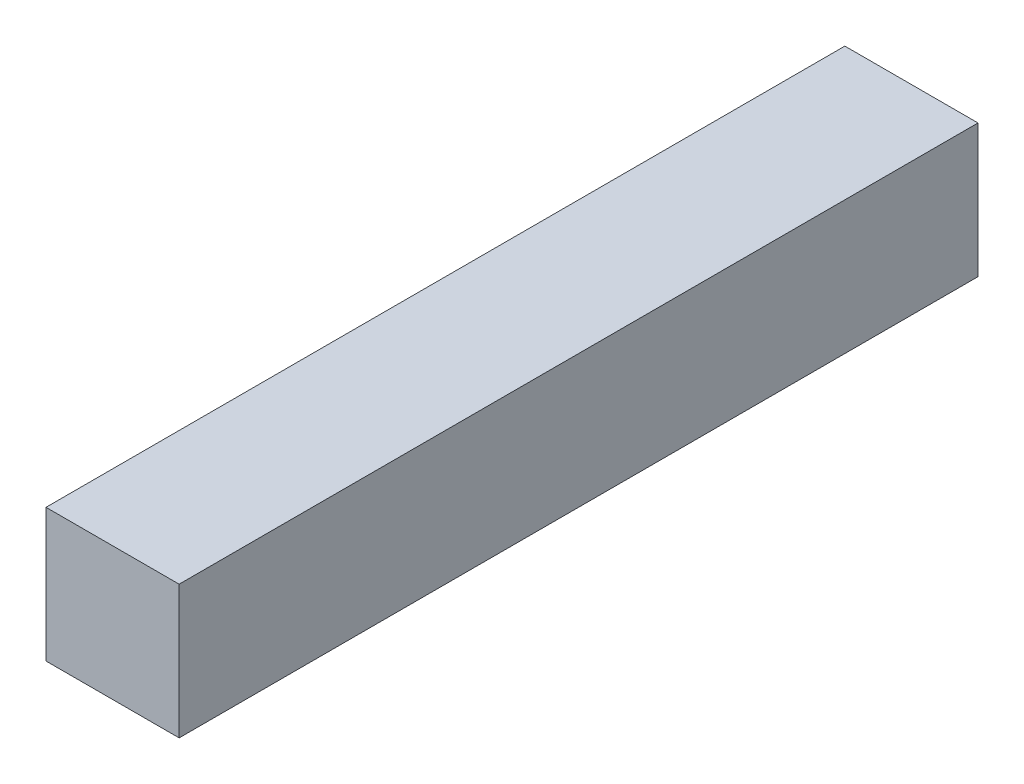
ISO-10303-21;
HEADER;
FILE_DESCRIPTION(('STEP AP214'),'2;1');
FILE_NAME('part.step','',(''),(''),'','','');
FILE_SCHEMA(('AUTOMOTIVE_DESIGN { 1 0 10303 214 1 1 1 1 }'));
ENDSEC;
DATA;
#1=APPLICATION_CONTEXT('core data for automotive mechanical design processes');
#2=APPLICATION_PROTOCOL_DEFINITION('international standard','automotive_design',2000,#1);
#3=PRODUCT_CONTEXT('',#1,'mechanical');
#4=PRODUCT('Part','Part','',(#3));
#5=PRODUCT_RELATED_PRODUCT_CATEGORY('part','',(#4));
#6=PRODUCT_DEFINITION_FORMATION('','',#4);
#7=PRODUCT_DEFINITION_CONTEXT('part definition',#1,'design');
#8=PRODUCT_DEFINITION('design','',#6,#7);
#9=PRODUCT_DEFINITION_SHAPE('','',#8);
#10=(LENGTH_UNIT() NAMED_UNIT(*) SI_UNIT(.MILLI.,.METRE.));
#11=(NAMED_UNIT(*) PLANE_ANGLE_UNIT() SI_UNIT($,.RADIAN.));
#12=(NAMED_UNIT(*) SI_UNIT($,.STERADIAN.) SOLID_ANGLE_UNIT());
#13=UNCERTAINTY_MEASURE_WITH_UNIT(LENGTH_MEASURE(1.E-05),#10,'distance_accuracy_value','');
#14=(GEOMETRIC_REPRESENTATION_CONTEXT(3) GLOBAL_UNCERTAINTY_ASSIGNED_CONTEXT((#13)) GLOBAL_UNIT_ASSIGNED_CONTEXT((#10,
#11,#12)) REPRESENTATION_CONTEXT('',''));
#15=CARTESIAN_POINT('',(0.,0.,0.));
#16=DIRECTION('',(0.,0.,1.));
#17=DIRECTION('',(1.,0.,0.));
#18=AXIS2_PLACEMENT_3D('',#15,#16,#17);
#19=CARTESIAN_POINT('',(0.,0.,30.));
#20=DIRECTION('',(1.,0.,0.));
#21=DIRECTION('',(0.,0.,-1.));
#22=AXIS2_PLACEMENT_3D('',#19,#20,#21);
#23=PLANE('',#22);
#24=DIRECTION('',(0.,-1.,0.));
#25=VECTOR('',#24,1.);
#26=CARTESIAN_POINT('',(0.,0.,0.));
#27=LINE('',#26,#25);
#28=CARTESIAN_POINT('',(0.,5.,0.));
#29=VERTEX_POINT('',#28);
#30=CARTESIAN_POINT('',(0.,0.,0.));
#31=VERTEX_POINT('',#30);
#32=EDGE_CURVE('E116',#29,#31,#27,.T.);
#33=ORIENTED_EDGE('',*,*,#32,.T.);
#34=DIRECTION('',(0.,0.,-1.));
#35=VECTOR('',#34,1.);
#36=CARTESIAN_POINT('',(0.,0.,30.));
#37=LINE('',#36,#35);
#38=CARTESIAN_POINT('',(0.,0.,30.));
#39=VERTEX_POINT('',#38);
#40=EDGE_CURVE('E11',#39,#31,#37,.T.);
#41=ORIENTED_EDGE('',*,*,#40,.F.);
#42=DIRECTION('',(0.,-1.,0.));
#43=VECTOR('',#42,1.);
#44=CARTESIAN_POINT('',(0.,0.,30.));
#45=LINE('',#44,#43);
#46=CARTESIAN_POINT('',(0.,5.,30.));
#47=VERTEX_POINT('',#46);
#48=EDGE_CURVE('E98',#47,#39,#45,.T.);
#49=ORIENTED_EDGE('',*,*,#48,.F.);
#50=DIRECTION('',(0.,0.,-1.));
#51=VECTOR('',#50,1.);
#52=CARTESIAN_POINT('',(0.,5.,30.));
#53=LINE('',#52,#51);
#54=EDGE_CURVE('E112',#47,#29,#53,.T.);
#55=ORIENTED_EDGE('',*,*,#54,.T.);
#56=EDGE_LOOP('',(#33,#41,#49,#55));
#57=FACE_BOUND('',#56,.T.);
#58=ADVANCED_FACE('F46',(#57),#23,.F.);
#59=CARTESIAN_POINT('',(0.,0.,30.));
#60=DIRECTION('',(0.,1.,0.));
#61=DIRECTION('',(0.,0.,1.));
#62=AXIS2_PLACEMENT_3D('',#59,#60,#61);
#63=PLANE('',#62);
#64=DIRECTION('',(1.,0.,0.));
#65=VECTOR('',#64,1.);
#66=CARTESIAN_POINT('',(0.,0.,0.));
#67=LINE('',#66,#65);
#68=CARTESIAN_POINT('',(5.,0.,0.));
#69=VERTEX_POINT('',#68);
#70=EDGE_CURVE('E103',#31,#69,#67,.T.);
#71=ORIENTED_EDGE('',*,*,#70,.T.);
#72=DIRECTION('',(0.,0.,-1.));
#73=VECTOR('',#72,1.);
#74=CARTESIAN_POINT('',(5.,0.,30.));
#75=LINE('',#74,#73);
#76=CARTESIAN_POINT('',(5.,0.,30.));
#77=VERTEX_POINT('',#76);
#78=EDGE_CURVE('E55',#77,#69,#75,.T.);
#79=ORIENTED_EDGE('',*,*,#78,.F.);
#80=DIRECTION('',(1.,0.,0.));
#81=VECTOR('',#80,1.);
#82=CARTESIAN_POINT('',(0.,0.,30.));
#83=LINE('',#82,#81);
#84=EDGE_CURVE('E93',#39,#77,#83,.T.);
#85=ORIENTED_EDGE('',*,*,#84,.F.);
#86=ORIENTED_EDGE('',*,*,#40,.T.);
#87=EDGE_LOOP('',(#71,#79,#85,#86));
#88=FACE_BOUND('',#87,.T.);
#89=ADVANCED_FACE('F102',(#88),#63,.F.);
#90=CARTESIAN_POINT('',(5.,0.,30.));
#91=DIRECTION('',(-1.,0.,0.));
#92=DIRECTION('',(0.,0.,1.));
#93=AXIS2_PLACEMENT_3D('',#90,#91,#92);
#94=PLANE('',#93);
#95=DIRECTION('',(0.,1.,0.));
#96=VECTOR('',#95,1.);
#97=CARTESIAN_POINT('',(5.,0.,0.));
#98=LINE('',#97,#96);
#99=CARTESIAN_POINT('',(5.,5.,0.));
#100=VERTEX_POINT('',#99);
#101=EDGE_CURVE('E80',#69,#100,#98,.T.);
#102=ORIENTED_EDGE('',*,*,#101,.T.);
#103=DIRECTION('',(0.,0.,-1.));
#104=VECTOR('',#103,1.);
#105=CARTESIAN_POINT('',(5.,5.,30.));
#106=LINE('',#105,#104);
#107=CARTESIAN_POINT('',(5.,5.,30.));
#108=VERTEX_POINT('',#107);
#109=EDGE_CURVE('E105',#108,#100,#106,.T.);
#110=ORIENTED_EDGE('',*,*,#109,.F.);
#111=DIRECTION('',(0.,1.,0.));
#112=VECTOR('',#111,1.);
#113=CARTESIAN_POINT('',(5.,0.,30.));
#114=LINE('',#113,#112);
#115=EDGE_CURVE('E96',#77,#108,#114,.T.);
#116=ORIENTED_EDGE('',*,*,#115,.F.);
#117=ORIENTED_EDGE('',*,*,#78,.T.);
#118=EDGE_LOOP('',(#102,#110,#116,#117));
#119=FACE_BOUND('',#118,.T.);
#120=ADVANCED_FACE('F106',(#119),#94,.F.);
#121=CARTESIAN_POINT('',(0.,5.,30.));
#122=DIRECTION('',(0.,-1.,0.));
#123=DIRECTION('',(0.,0.,-1.));
#124=AXIS2_PLACEMENT_3D('',#121,#122,#123);
#125=PLANE('',#124);
#126=DIRECTION('',(-1.,0.,0.));
#127=VECTOR('',#126,1.);
#128=CARTESIAN_POINT('',(0.,5.,0.));
#129=LINE('',#128,#127);
#130=EDGE_CURVE('E86',#100,#29,#129,.T.);
#131=ORIENTED_EDGE('',*,*,#130,.T.);
#132=ORIENTED_EDGE('',*,*,#54,.F.);
#133=DIRECTION('',(-1.,0.,0.));
#134=VECTOR('',#133,1.);
#135=CARTESIAN_POINT('',(0.,5.,30.));
#136=LINE('',#135,#134);
#137=EDGE_CURVE('E63',#108,#47,#136,.T.);
#138=ORIENTED_EDGE('',*,*,#137,.F.);
#139=ORIENTED_EDGE('',*,*,#109,.T.);
#140=EDGE_LOOP('',(#131,#132,#138,#139));
#141=FACE_BOUND('',#140,.T.);
#142=ADVANCED_FACE('F128',(#141),#125,.F.);
#143=CARTESIAN_POINT('',(0.,0.,30.));
#144=DIRECTION('',(0.,0.,-1.));
#145=DIRECTION('',(-1.,0.,0.));
#146=AXIS2_PLACEMENT_3D('',#143,#144,#145);
#147=PLANE('',#146);
#148=ORIENTED_EDGE('',*,*,#48,.T.);
#149=ORIENTED_EDGE('',*,*,#84,.T.);
#150=ORIENTED_EDGE('',*,*,#115,.T.);
#151=ORIENTED_EDGE('',*,*,#137,.T.);
#152=EDGE_LOOP('',(#148,#149,#150,#151));
#153=FACE_BOUND('',#152,.T.);
#154=ADVANCED_FACE('F94',(#153),#147,.F.);
#155=CARTESIAN_POINT('',(0.,0.,0.));
#156=DIRECTION('',(0.,0.,-1.));
#157=DIRECTION('',(-1.,0.,0.));
#158=AXIS2_PLACEMENT_3D('',#155,#156,#157);
#159=PLANE('',#158);
#160=ORIENTED_EDGE('',*,*,#32,.F.);
#161=ORIENTED_EDGE('',*,*,#130,.F.);
#162=ORIENTED_EDGE('',*,*,#101,.F.);
#163=ORIENTED_EDGE('',*,*,#70,.F.);
#164=EDGE_LOOP('',(#160,#161,#162,#163));
#165=FACE_BOUND('',#164,.T.);
#166=ADVANCED_FACE('F131',(#165),#159,.T.);
#167=CLOSED_SHELL('',(#58,#89,#120,#142,#154,#166));
#168=MANIFOLD_SOLID_BREP('B2',#167);
#169=ADVANCED_BREP_SHAPE_REPRESENTATION('',(#18,#168),#14);
#170=SHAPE_DEFINITION_REPRESENTATION(#9,#169);
ENDSEC;
END-ISO-10303-21;
